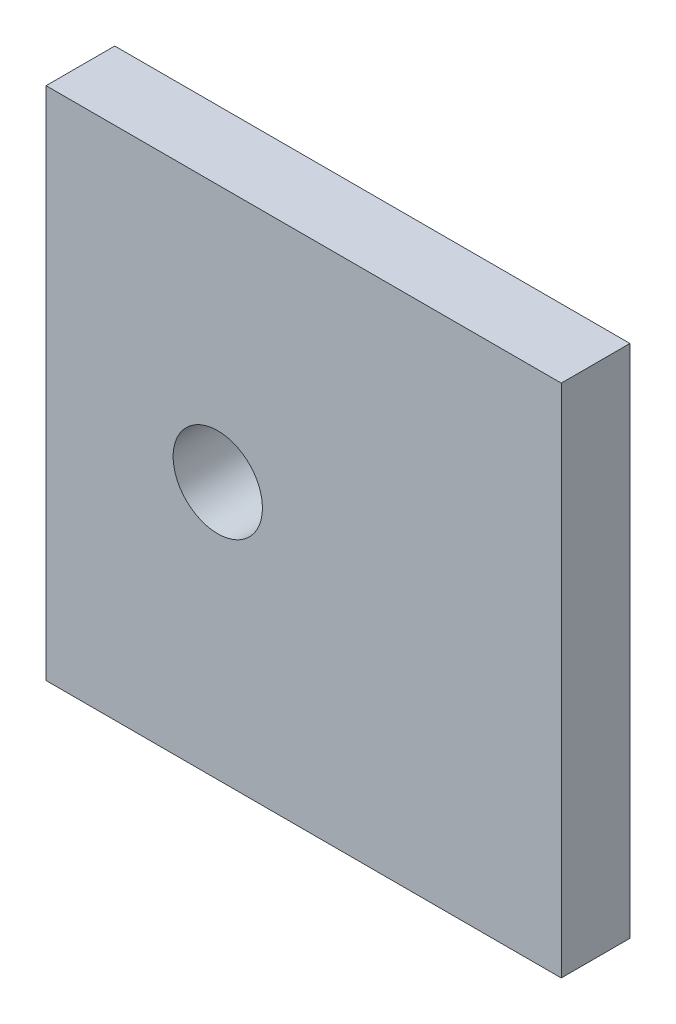
ISO-10303-21;
HEADER;
FILE_DESCRIPTION(('STEP AP214'),'2;1');
FILE_NAME('part.step','',(''),(''),'','','');
FILE_SCHEMA(('AUTOMOTIVE_DESIGN { 1 0 10303 214 1 1 1 1 }'));
ENDSEC;
DATA;
#1=APPLICATION_CONTEXT('core data for automotive mechanical design processes');
#2=APPLICATION_PROTOCOL_DEFINITION('international standard','automotive_design',2000,#1);
#3=PRODUCT_CONTEXT('',#1,'mechanical');
#4=PRODUCT('Part','Part','',(#3));
#5=PRODUCT_RELATED_PRODUCT_CATEGORY('part','',(#4));
#6=PRODUCT_DEFINITION_FORMATION('','',#4);
#7=PRODUCT_DEFINITION_CONTEXT('part definition',#1,'design');
#8=PRODUCT_DEFINITION('design','',#6,#7);
#9=PRODUCT_DEFINITION_SHAPE('','',#8);
#10=(LENGTH_UNIT() NAMED_UNIT(*) SI_UNIT(.MILLI.,.METRE.));
#11=(NAMED_UNIT(*) PLANE_ANGLE_UNIT() SI_UNIT($,.RADIAN.));
#12=(NAMED_UNIT(*) SI_UNIT($,.STERADIAN.) SOLID_ANGLE_UNIT());
#13=UNCERTAINTY_MEASURE_WITH_UNIT(LENGTH_MEASURE(1.E-05),#10,'distance_accuracy_value','');
#14=(GEOMETRIC_REPRESENTATION_CONTEXT(3) GLOBAL_UNCERTAINTY_ASSIGNED_CONTEXT((#13)) GLOBAL_UNIT_ASSIGNED_CONTEXT((#10,
#11,#12)) REPRESENTATION_CONTEXT('',''));
#15=CARTESIAN_POINT('',(0.,0.,0.));
#16=DIRECTION('',(0.,0.,1.));
#17=DIRECTION('',(1.,0.,0.));
#18=AXIS2_PLACEMENT_3D('',#15,#16,#17);
#19=CARTESIAN_POINT('',(0.,0.,20.));
#20=DIRECTION('',(1.,0.,0.));
#21=DIRECTION('',(0.,0.,-1.00000000000001));
#22=AXIS2_PLACEMENT_3D('',#19,#20,#21);
#23=PLANE('',#22);
#24=DIRECTION('',(0.,-1.00000000000001,0.));
#25=VECTOR('',#24,1.);
#26=CARTESIAN_POINT('',(0.,0.,0.));
#27=LINE('',#26,#25);
#28=CARTESIAN_POINT('',(0.,150.,1.66533453693773E-13));
#29=VERTEX_POINT('',#28);
#30=CARTESIAN_POINT('',(0.,0.,0.));
#31=VERTEX_POINT('',#30);
#32=EDGE_CURVE('E78',#29,#31,#27,.T.);
#33=ORIENTED_EDGE('',*,*,#32,.T.);
#34=DIRECTION('',(0.,0.,-1.00000000000001));
#35=VECTOR('',#34,1.);
#36=CARTESIAN_POINT('',(0.,0.,20.));
#37=LINE('',#36,#35);
#38=CARTESIAN_POINT('',(0.,0.,20.));
#39=VERTEX_POINT('',#38);
#40=EDGE_CURVE('E11',#39,#31,#37,.T.);
#41=ORIENTED_EDGE('',*,*,#40,.F.);
#42=DIRECTION('',(0.,-1.00000000000001,0.));
#43=VECTOR('',#42,1.);
#44=CARTESIAN_POINT('',(0.,0.,20.));
#45=LINE('',#44,#43);
#46=CARTESIAN_POINT('',(0.,150.000000000001,20.0000000000002));
#47=VERTEX_POINT('',#46);
#48=EDGE_CURVE('E101',#47,#39,#45,.T.);
#49=ORIENTED_EDGE('',*,*,#48,.F.);
#50=DIRECTION('',(0.,0.,-1.00000000000001));
#51=VECTOR('',#50,1.);
#52=CARTESIAN_POINT('',(0.,150.000000000001,20.0000000000002));
#53=LINE('',#52,#51);
#54=EDGE_CURVE('E90',#47,#29,#53,.T.);
#55=ORIENTED_EDGE('',*,*,#54,.T.);
#56=EDGE_LOOP('',(#33,#41,#49,#55));
#57=FACE_BOUND('',#56,.T.);
#58=ADVANCED_FACE('F34',(#57),#23,.F.);
#59=CARTESIAN_POINT('',(0.,0.,20.));
#60=DIRECTION('',(0.,1.00000000000001,0.));
#61=DIRECTION('',(0.,0.,1.00000000000001));
#62=AXIS2_PLACEMENT_3D('',#59,#60,#61);
#63=PLANE('',#62);
#64=DIRECTION('',(1.,0.,0.));
#65=VECTOR('',#64,1.);
#66=CARTESIAN_POINT('',(0.,0.,0.));
#67=LINE('',#66,#65);
#68=CARTESIAN_POINT('',(150.,3.33066907387547E-13,0.));
#69=VERTEX_POINT('',#68);
#70=EDGE_CURVE('E74',#31,#69,#67,.T.);
#71=ORIENTED_EDGE('',*,*,#70,.T.);
#72=DIRECTION('',(0.,0.,-1.00000000000001));
#73=VECTOR('',#72,1.);
#74=CARTESIAN_POINT('',(150.,0.,20.));
#75=LINE('',#74,#73);
#76=CARTESIAN_POINT('',(150.,0.,20.));
#77=VERTEX_POINT('',#76);
#78=EDGE_CURVE('E41',#77,#69,#75,.T.);
#79=ORIENTED_EDGE('',*,*,#78,.F.);
#80=DIRECTION('',(1.,0.,0.));
#81=VECTOR('',#80,1.);
#82=CARTESIAN_POINT('',(0.,0.,20.));
#83=LINE('',#82,#81);
#84=EDGE_CURVE('E86',#39,#77,#83,.T.);
#85=ORIENTED_EDGE('',*,*,#84,.F.);
#86=ORIENTED_EDGE('',*,*,#40,.T.);
#87=EDGE_LOOP('',(#71,#79,#85,#86));
#88=FACE_BOUND('',#87,.T.);
#89=ADVANCED_FACE('F85',(#88),#63,.F.);
#90=CARTESIAN_POINT('',(150.,0.,20.));
#91=DIRECTION('',(-1.,0.,0.));
#92=DIRECTION('',(0.,0.,1.00000000000001));
#93=AXIS2_PLACEMENT_3D('',#90,#91,#92);
#94=PLANE('',#93);
#95=DIRECTION('',(0.,1.00000000000001,0.));
#96=VECTOR('',#95,1.);
#97=CARTESIAN_POINT('',(150.,3.33066907387547E-13,0.));
#98=LINE('',#97,#96);
#99=CARTESIAN_POINT('',(150.,150.000000000001,1.66533453693773E-13));
#100=VERTEX_POINT('',#99);
#101=EDGE_CURVE('E79',#69,#100,#98,.T.);
#102=ORIENTED_EDGE('',*,*,#101,.T.);
#103=DIRECTION('',(0.,0.,-1.00000000000001));
#104=VECTOR('',#103,1.);
#105=CARTESIAN_POINT('',(150.,150.000000000002,20.));
#106=LINE('',#105,#104);
#107=CARTESIAN_POINT('',(150.,150.000000000002,20.));
#108=VERTEX_POINT('',#107);
#109=EDGE_CURVE('E107',#108,#100,#106,.T.);
#110=ORIENTED_EDGE('',*,*,#109,.F.);
#111=DIRECTION('',(0.,1.00000000000001,0.));
#112=VECTOR('',#111,1.);
#113=CARTESIAN_POINT('',(150.,0.,20.));
#114=LINE('',#113,#112);
#115=EDGE_CURVE('E53',#77,#108,#114,.T.);
#116=ORIENTED_EDGE('',*,*,#115,.F.);
#117=ORIENTED_EDGE('',*,*,#78,.T.);
#118=EDGE_LOOP('',(#102,#110,#116,#117));
#119=FACE_BOUND('',#118,.T.);
#120=ADVANCED_FACE('F110',(#119),#94,.F.);
#121=CARTESIAN_POINT('',(0.,150.000000000001,20.0000000000002));
#122=DIRECTION('',(0.,-1.00000000000001,0.));
#123=DIRECTION('',(0.,0.,-1.00000000000001));
#124=AXIS2_PLACEMENT_3D('',#121,#122,#123);
#125=PLANE('',#124);
#126=DIRECTION('',(-1.,0.,0.));
#127=VECTOR('',#126,1.);
#128=CARTESIAN_POINT('',(0.,150.,1.66533453693773E-13));
#129=LINE('',#128,#127);
#130=EDGE_CURVE('E99',#100,#29,#129,.T.);
#131=ORIENTED_EDGE('',*,*,#130,.T.);
#132=ORIENTED_EDGE('',*,*,#54,.F.);
#133=DIRECTION('',(-1.,0.,0.));
#134=VECTOR('',#133,1.);
#135=CARTESIAN_POINT('',(0.,150.000000000001,20.0000000000002));
#136=LINE('',#135,#134);
#137=EDGE_CURVE('E48',#108,#47,#136,.T.);
#138=ORIENTED_EDGE('',*,*,#137,.F.);
#139=ORIENTED_EDGE('',*,*,#109,.T.);
#140=EDGE_LOOP('',(#131,#132,#138,#139));
#141=FACE_BOUND('',#140,.T.);
#142=ADVANCED_FACE('F112',(#141),#125,.F.);
#143=CARTESIAN_POINT('',(0.,150.000000000001,20.0000000000002));
#144=DIRECTION('',(0.,0.,-1.00000000000001));
#145=DIRECTION('',(-1.,0.,0.));
#146=AXIS2_PLACEMENT_3D('',#143,#144,#145);
#147=PLANE('',#146);
#148=CARTESIAN_POINT('',(50.0000000000001,75.0000000000004,20.));
#149=DIRECTION('',(0.,0.,1.00000000000001));
#150=DIRECTION('',(1.,0.,0.));
#151=AXIS2_PLACEMENT_3D('',#148,#149,#150);
#152=CIRCLE('',#151,13.);
#153=CARTESIAN_POINT('',(63.0000000000001,75.0000000000004,20.));
#154=VERTEX_POINT('',#153);
#155=EDGE_CURVE('E94',#154,#154,#152,.T.);
#156=ORIENTED_EDGE('',*,*,#155,.F.);
#157=EDGE_LOOP('',(#156));
#158=FACE_BOUND('',#157,.T.);
#159=ORIENTED_EDGE('',*,*,#48,.T.);
#160=ORIENTED_EDGE('',*,*,#84,.T.);
#161=ORIENTED_EDGE('',*,*,#115,.T.);
#162=ORIENTED_EDGE('',*,*,#137,.T.);
#163=EDGE_LOOP('',(#159,#160,#161,#162));
#164=FACE_BOUND('',#163,.T.);
#165=ADVANCED_FACE('F113',(#158,#164),#147,.F.);
#166=CARTESIAN_POINT('',(0.,150.,1.66533453693773E-13));
#167=DIRECTION('',(0.,0.,-1.00000000000001));
#168=DIRECTION('',(-1.,0.,0.));
#169=AXIS2_PLACEMENT_3D('',#166,#167,#168);
#170=PLANE('',#169);
#171=CARTESIAN_POINT('',(50.,75.0000000000005,0.));
#172=DIRECTION('',(0.,0.,1.00000000000001));
#173=DIRECTION('',(1.,0.,0.));
#174=AXIS2_PLACEMENT_3D('',#171,#172,#173);
#175=CIRCLE('',#174,13.);
#176=CARTESIAN_POINT('',(62.9999999999999,75.0000000000005,0.));
#177=VERTEX_POINT('',#176);
#178=EDGE_CURVE('E91',#177,#177,#175,.T.);
#179=ORIENTED_EDGE('',*,*,#178,.T.);
#180=EDGE_LOOP('',(#179));
#181=FACE_BOUND('',#180,.T.);
#182=ORIENTED_EDGE('',*,*,#32,.F.);
#183=ORIENTED_EDGE('',*,*,#130,.F.);
#184=ORIENTED_EDGE('',*,*,#101,.F.);
#185=ORIENTED_EDGE('',*,*,#70,.F.);
#186=EDGE_LOOP('',(#182,#183,#184,#185));
#187=FACE_BOUND('',#186,.T.);
#188=ADVANCED_FACE('F75',(#181,#187),#170,.T.);
#189=CARTESIAN_POINT('',(50.,75.0000000000005,0.));
#190=DIRECTION('',(0.,0.,1.00000000000001));
#191=DIRECTION('',(1.,0.,0.));
#192=AXIS2_PLACEMENT_3D('',#189,#190,#191);
#193=CYLINDRICAL_SURFACE('',#192,13.);
#194=ORIENTED_EDGE('',*,*,#178,.F.);
#195=EDGE_LOOP('',(#194));
#196=FACE_BOUND('',#195,.T.);
#197=ORIENTED_EDGE('',*,*,#155,.T.);
#198=EDGE_LOOP('',(#197));
#199=FACE_BOUND('',#198,.T.);
#200=ADVANCED_FACE('F121',(#196,#199),#193,.F.);
#201=CLOSED_SHELL('',(#58,#89,#120,#142,#165,#188,#200));
#202=MANIFOLD_SOLID_BREP('B2',#201);
#203=ADVANCED_BREP_SHAPE_REPRESENTATION('',(#18,#202),#14);
#204=SHAPE_DEFINITION_REPRESENTATION(#9,#203);
ENDSEC;
END-ISO-10303-21;
